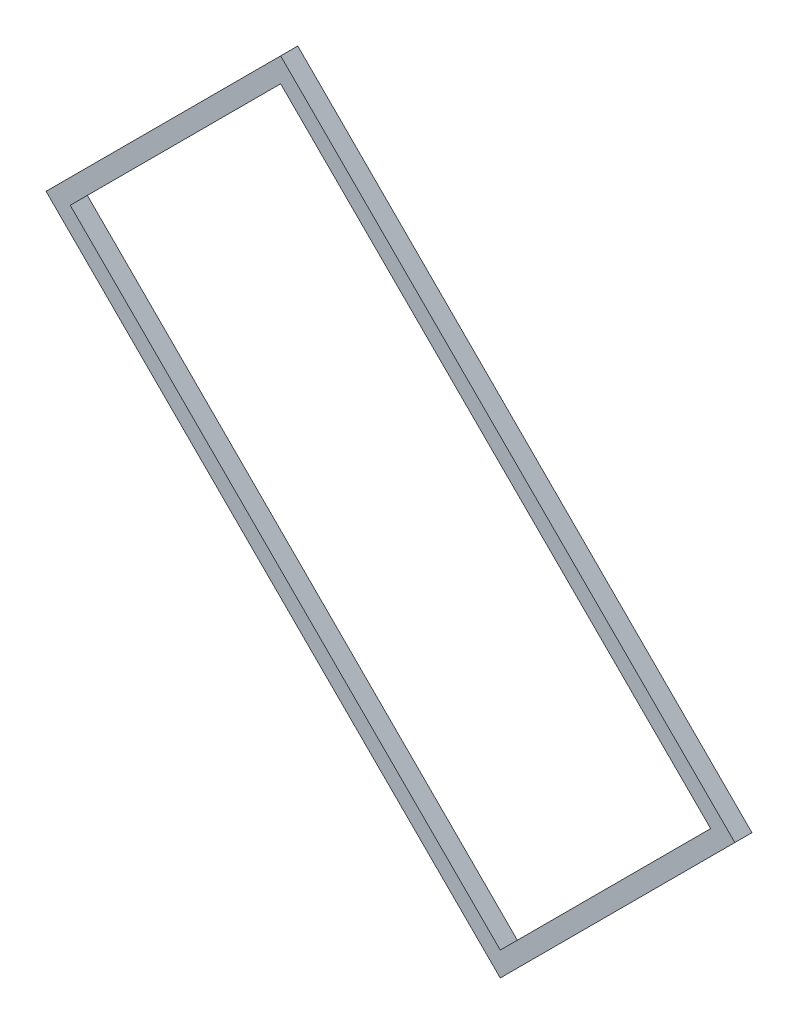
ISO-10303-21;
HEADER;
FILE_DESCRIPTION(('STEP AP214'),'2;1');
FILE_NAME('part.step','',(''),(''),'','','');
FILE_SCHEMA(('AUTOMOTIVE_DESIGN { 1 0 10303 214 1 1 1 1 }'));
ENDSEC;
DATA;
#1=APPLICATION_CONTEXT('core data for automotive mechanical design processes');
#2=APPLICATION_PROTOCOL_DEFINITION('international standard','automotive_design',2000,#1);
#3=PRODUCT_CONTEXT('',#1,'mechanical');
#4=PRODUCT('Part','Part','',(#3));
#5=PRODUCT_RELATED_PRODUCT_CATEGORY('part','',(#4));
#6=PRODUCT_DEFINITION_FORMATION('','',#4);
#7=PRODUCT_DEFINITION_CONTEXT('part definition',#1,'design');
#8=PRODUCT_DEFINITION('design','',#6,#7);
#9=PRODUCT_DEFINITION_SHAPE('','',#8);
#10=(LENGTH_UNIT() NAMED_UNIT(*) SI_UNIT(.MILLI.,.METRE.));
#11=(NAMED_UNIT(*) PLANE_ANGLE_UNIT() SI_UNIT($,.RADIAN.));
#12=(NAMED_UNIT(*) SI_UNIT($,.STERADIAN.) SOLID_ANGLE_UNIT());
#13=UNCERTAINTY_MEASURE_WITH_UNIT(LENGTH_MEASURE(1.E-05),#10,'distance_accuracy_value','');
#14=(GEOMETRIC_REPRESENTATION_CONTEXT(3) GLOBAL_UNCERTAINTY_ASSIGNED_CONTEXT((#13)) GLOBAL_UNIT_ASSIGNED_CONTEXT((#10,
#11,#12)) REPRESENTATION_CONTEXT('',''));
#15=CARTESIAN_POINT('',(0.,0.,0.));
#16=DIRECTION('',(0.,0.,1.));
#17=DIRECTION('',(1.,0.,0.));
#18=AXIS2_PLACEMENT_3D('',#15,#16,#17);
#19=CARTESIAN_POINT('',(-440.645068580759,52.202795795514,0.));
#20=DIRECTION('',(0.,0.,1.));
#21=DIRECTION('',(1.,0.,0.));
#22=AXIS2_PLACEMENT_3D('',#19,#20,#21);
#23=PLANE('',#22);
#24=DIRECTION('',(0.707106781186548,-0.707106781186547,0.));
#25=VECTOR('',#24,1.);
#26=CARTESIAN_POINT('',(-472.747716446628,145.823733624613,0.));
#27=LINE('',#26,#25);
#28=CARTESIAN_POINT('',(-472.747716446628,145.823733624613,0.));
#29=VERTEX_POINT('',#28);
#30=CARTESIAN_POINT('',(-347.02413075166,20.1001479296447,0.));
#31=VERTEX_POINT('',#30);
#32=EDGE_CURVE('E102',#29,#31,#27,.T.);
#33=ORIENTED_EDGE('',*,*,#32,.F.);
#34=DIRECTION('',(0.707106781186547,0.707106781186548,0.));
#35=VECTOR('',#34,1.);
#36=CARTESIAN_POINT('',(-534.266006409857,84.3054436613831,0.));
#37=LINE('',#36,#35);
#38=CARTESIAN_POINT('',(-534.266006409857,84.3054436613831,0.));
#39=VERTEX_POINT('',#38);
#40=EDGE_CURVE('E107',#39,#29,#37,.T.);
#41=ORIENTED_EDGE('',*,*,#40,.F.);
#42=DIRECTION('',(-0.707106781186548,0.707106781186547,0.));
#43=VECTOR('',#42,1.);
#44=CARTESIAN_POINT('',(-408.542420714889,-41.4181420335849,0.));
#45=LINE('',#44,#43);
#46=CARTESIAN_POINT('',(-408.542420714889,-41.4181420335849,0.));
#47=VERTEX_POINT('',#46);
#48=EDGE_CURVE('E156',#47,#39,#45,.T.);
#49=ORIENTED_EDGE('',*,*,#48,.F.);
#50=DIRECTION('',(-0.707106781186549,-0.707106781186547,0.));
#51=VECTOR('',#50,1.);
#52=CARTESIAN_POINT('',(-347.02413075166,20.1001479296447,0.));
#53=LINE('',#52,#51);
#54=EDGE_CURVE('E108',#31,#47,#53,.T.);
#55=ORIENTED_EDGE('',*,*,#54,.F.);
#56=EDGE_LOOP('',(#33,#41,#49,#55));
#57=FACE_BOUND('',#56,.T.);
#58=DIRECTION('',(-0.707106781186548,0.707106781186547,0.));
#59=VECTOR('',#58,1.);
#60=CARTESIAN_POINT('',(-408.542420714889,-48.4892098454504,0.));
#61=LINE('',#60,#59);
#62=CARTESIAN_POINT('',(-408.542420714889,-48.4892098454504,0.));
#63=VERTEX_POINT('',#62);
#64=CARTESIAN_POINT('',(-541.337074221723,84.3054436613831,0.));
#65=VERTEX_POINT('',#64);
#66=EDGE_CURVE('E26',#63,#65,#61,.T.);
#67=ORIENTED_EDGE('',*,*,#66,.T.);
#68=DIRECTION('',(0.707106781186547,0.707106781186548,0.));
#69=VECTOR('',#68,1.);
#70=CARTESIAN_POINT('',(-541.337074221723,84.3054436613831,0.));
#71=LINE('',#70,#69);
#72=CARTESIAN_POINT('',(-472.747716446628,152.894801436478,0.));
#73=VERTEX_POINT('',#72);
#74=EDGE_CURVE('E137',#65,#73,#71,.T.);
#75=ORIENTED_EDGE('',*,*,#74,.T.);
#76=DIRECTION('',(0.707106781186548,-0.707106781186547,0.));
#77=VECTOR('',#76,1.);
#78=CARTESIAN_POINT('',(-472.747716446628,152.894801436478,0.));
#79=LINE('',#78,#77);
#80=CARTESIAN_POINT('',(-339.953062939794,20.1001479296447,0.));
#81=VERTEX_POINT('',#80);
#82=EDGE_CURVE('E150',#73,#81,#79,.T.);
#83=ORIENTED_EDGE('',*,*,#82,.T.);
#84=DIRECTION('',(-0.707106781186548,-0.707106781186547,0.));
#85=VECTOR('',#84,1.);
#86=CARTESIAN_POINT('',(-339.953062939794,20.1001479296447,0.));
#87=LINE('',#86,#85);
#88=EDGE_CURVE('E183',#81,#63,#87,.T.);
#89=ORIENTED_EDGE('',*,*,#88,.T.);
#90=EDGE_LOOP('',(#67,#75,#83,#89));
#91=FACE_BOUND('',#90,.T.);
#92=ADVANCED_FACE('F17',(#57,#91),#23,.F.);
#93=CARTESIAN_POINT('',(-440.645068580759,52.202795795514,5.));
#94=DIRECTION('',(0.,0.,1.));
#95=DIRECTION('',(1.,0.,0.));
#96=AXIS2_PLACEMENT_3D('',#93,#94,#95);
#97=PLANE('',#96);
#98=DIRECTION('',(0.707106781186548,-0.707106781186547,0.));
#99=VECTOR('',#98,1.);
#100=CARTESIAN_POINT('',(-472.747716446628,145.823733624613,5.));
#101=LINE('',#100,#99);
#102=CARTESIAN_POINT('',(-472.747716446628,145.823733624613,5.));
#103=VERTEX_POINT('',#102);
#104=CARTESIAN_POINT('',(-347.02413075166,20.1001479296447,5.));
#105=VERTEX_POINT('',#104);
#106=EDGE_CURVE('E113',#103,#105,#101,.T.);
#107=ORIENTED_EDGE('',*,*,#106,.T.);
#108=DIRECTION('',(-0.707106781186549,-0.707106781186547,0.));
#109=VECTOR('',#108,1.);
#110=CARTESIAN_POINT('',(-347.02413075166,20.1001479296447,5.));
#111=LINE('',#110,#109);
#112=CARTESIAN_POINT('',(-408.542420714889,-41.4181420335849,5.));
#113=VERTEX_POINT('',#112);
#114=EDGE_CURVE('E163',#105,#113,#111,.T.);
#115=ORIENTED_EDGE('',*,*,#114,.T.);
#116=DIRECTION('',(-0.707106781186548,0.707106781186547,0.));
#117=VECTOR('',#116,1.);
#118=CARTESIAN_POINT('',(-408.542420714889,-41.4181420335849,5.));
#119=LINE('',#118,#117);
#120=CARTESIAN_POINT('',(-534.266006409857,84.3054436613831,5.));
#121=VERTEX_POINT('',#120);
#122=EDGE_CURVE('E144',#113,#121,#119,.T.);
#123=ORIENTED_EDGE('',*,*,#122,.T.);
#124=DIRECTION('',(0.707106781186547,0.707106781186548,0.));
#125=VECTOR('',#124,1.);
#126=CARTESIAN_POINT('',(-534.266006409857,84.3054436613831,5.));
#127=LINE('',#126,#125);
#128=EDGE_CURVE('E123',#121,#103,#127,.T.);
#129=ORIENTED_EDGE('',*,*,#128,.T.);
#130=EDGE_LOOP('',(#107,#115,#123,#129));
#131=FACE_BOUND('',#130,.T.);
#132=DIRECTION('',(0.707106781186548,-0.707106781186547,0.));
#133=VECTOR('',#132,1.);
#134=CARTESIAN_POINT('',(-408.542420714889,-48.4892098454504,5.));
#135=LINE('',#134,#133);
#136=CARTESIAN_POINT('',(-541.337074221723,84.3054436613831,5.));
#137=VERTEX_POINT('',#136);
#138=CARTESIAN_POINT('',(-408.542420714889,-48.4892098454504,5.));
#139=VERTEX_POINT('',#138);
#140=EDGE_CURVE('E11',#137,#139,#135,.T.);
#141=ORIENTED_EDGE('',*,*,#140,.T.);
#142=DIRECTION('',(0.707106781186548,0.707106781186547,0.));
#143=VECTOR('',#142,1.);
#144=CARTESIAN_POINT('',(-339.953062939794,20.1001479296447,5.));
#145=LINE('',#144,#143);
#146=CARTESIAN_POINT('',(-339.953062939794,20.1001479296447,5.));
#147=VERTEX_POINT('',#146);
#148=EDGE_CURVE('E187',#139,#147,#145,.T.);
#149=ORIENTED_EDGE('',*,*,#148,.T.);
#150=DIRECTION('',(-0.707106781186548,0.707106781186547,0.));
#151=VECTOR('',#150,1.);
#152=CARTESIAN_POINT('',(-472.747716446628,152.894801436478,5.));
#153=LINE('',#152,#151);
#154=CARTESIAN_POINT('',(-472.747716446628,152.894801436478,5.));
#155=VERTEX_POINT('',#154);
#156=EDGE_CURVE('E169',#147,#155,#153,.T.);
#157=ORIENTED_EDGE('',*,*,#156,.T.);
#158=DIRECTION('',(-0.707106781186547,-0.707106781186548,0.));
#159=VECTOR('',#158,1.);
#160=CARTESIAN_POINT('',(-541.337074221723,84.3054436613831,5.));
#161=LINE('',#160,#159);
#162=EDGE_CURVE('E151',#155,#137,#161,.T.);
#163=ORIENTED_EDGE('',*,*,#162,.T.);
#164=EDGE_LOOP('',(#141,#149,#157,#163));
#165=FACE_BOUND('',#164,.T.);
#166=ADVANCED_FACE('F19',(#131,#165),#97,.T.);
#167=CARTESIAN_POINT('',(-541.337074221723,84.3054436613831,0.));
#168=DIRECTION('',(-0.707106781186547,-0.707106781186548,0.));
#169=DIRECTION('',(-0.707106781186548,0.707106781186547,0.));
#170=AXIS2_PLACEMENT_3D('',#167,#168,#169);
#171=PLANE('',#170);
#172=ORIENTED_EDGE('',*,*,#66,.F.);
#173=DIRECTION('',(0.,0.,1.));
#174=VECTOR('',#173,1.);
#175=CARTESIAN_POINT('',(-408.542420714889,-48.4892098454504,0.));
#176=LINE('',#175,#174);
#177=EDGE_CURVE('E190',#63,#139,#176,.T.);
#178=ORIENTED_EDGE('',*,*,#177,.T.);
#179=ORIENTED_EDGE('',*,*,#140,.F.);
#180=DIRECTION('',(0.,0.,1.));
#181=VECTOR('',#180,1.);
#182=CARTESIAN_POINT('',(-541.337074221723,84.3054436613831,0.));
#183=LINE('',#182,#181);
#184=EDGE_CURVE('E140',#65,#137,#183,.T.);
#185=ORIENTED_EDGE('',*,*,#184,.F.);
#186=EDGE_LOOP('',(#172,#178,#179,#185));
#187=FACE_BOUND('',#186,.T.);
#188=ADVANCED_FACE('F194',(#187),#171,.T.);
#189=CARTESIAN_POINT('',(-408.542420714889,-48.4892098454504,0.));
#190=DIRECTION('',(0.707106781186547,-0.707106781186548,0.));
#191=DIRECTION('',(0.,0.,-1.));
#192=AXIS2_PLACEMENT_3D('',#189,#190,#191);
#193=PLANE('',#192);
#194=ORIENTED_EDGE('',*,*,#88,.F.);
#195=DIRECTION('',(0.,0.,1.));
#196=VECTOR('',#195,1.);
#197=CARTESIAN_POINT('',(-339.953062939794,20.1001479296447,0.));
#198=LINE('',#197,#196);
#199=EDGE_CURVE('E179',#81,#147,#198,.T.);
#200=ORIENTED_EDGE('',*,*,#199,.T.);
#201=ORIENTED_EDGE('',*,*,#148,.F.);
#202=ORIENTED_EDGE('',*,*,#177,.F.);
#203=EDGE_LOOP('',(#194,#200,#201,#202));
#204=FACE_BOUND('',#203,.T.);
#205=ADVANCED_FACE('F205',(#204),#193,.T.);
#206=CARTESIAN_POINT('',(-339.953062939794,20.1001479296447,0.));
#207=DIRECTION('',(0.707106781186547,0.707106781186548,0.));
#208=DIRECTION('',(0.,0.,-1.));
#209=AXIS2_PLACEMENT_3D('',#206,#207,#208);
#210=PLANE('',#209);
#211=ORIENTED_EDGE('',*,*,#82,.F.);
#212=DIRECTION('',(0.,0.,1.));
#213=VECTOR('',#212,1.);
#214=CARTESIAN_POINT('',(-472.747716446628,152.894801436478,0.));
#215=LINE('',#214,#213);
#216=EDGE_CURVE('E146',#73,#155,#215,.T.);
#217=ORIENTED_EDGE('',*,*,#216,.T.);
#218=ORIENTED_EDGE('',*,*,#156,.F.);
#219=ORIENTED_EDGE('',*,*,#199,.F.);
#220=EDGE_LOOP('',(#211,#217,#218,#219));
#221=FACE_BOUND('',#220,.T.);
#222=ADVANCED_FACE('F201',(#221),#210,.T.);
#223=CARTESIAN_POINT('',(-472.747716446628,152.894801436478,0.));
#224=DIRECTION('',(-0.707106781186548,0.707106781186547,0.));
#225=DIRECTION('',(0.,0.,1.));
#226=AXIS2_PLACEMENT_3D('',#223,#224,#225);
#227=PLANE('',#226);
#228=ORIENTED_EDGE('',*,*,#74,.F.);
#229=ORIENTED_EDGE('',*,*,#184,.T.);
#230=ORIENTED_EDGE('',*,*,#162,.F.);
#231=ORIENTED_EDGE('',*,*,#216,.F.);
#232=EDGE_LOOP('',(#228,#229,#230,#231));
#233=FACE_BOUND('',#232,.T.);
#234=ADVANCED_FACE('F198',(#233),#227,.T.);
#235=CARTESIAN_POINT('',(-472.747716446628,145.823733624613,0.));
#236=DIRECTION('',(-0.707106781186547,-0.707106781186548,0.));
#237=DIRECTION('',(-0.707106781186548,0.707106781186547,0.));
#238=AXIS2_PLACEMENT_3D('',#235,#236,#237);
#239=PLANE('',#238);
#240=ORIENTED_EDGE('',*,*,#32,.T.);
#241=DIRECTION('',(0.,0.,1.));
#242=VECTOR('',#241,1.);
#243=CARTESIAN_POINT('',(-347.02413075166,20.1001479296447,0.));
#244=LINE('',#243,#242);
#245=EDGE_CURVE('E114',#31,#105,#244,.T.);
#246=ORIENTED_EDGE('',*,*,#245,.T.);
#247=ORIENTED_EDGE('',*,*,#106,.F.);
#248=DIRECTION('',(0.,0.,1.));
#249=VECTOR('',#248,1.);
#250=CARTESIAN_POINT('',(-472.747716446628,145.823733624613,0.));
#251=LINE('',#250,#249);
#252=EDGE_CURVE('E117',#29,#103,#251,.T.);
#253=ORIENTED_EDGE('',*,*,#252,.F.);
#254=EDGE_LOOP('',(#240,#246,#247,#253));
#255=FACE_BOUND('',#254,.T.);
#256=ADVANCED_FACE('F118',(#255),#239,.T.);
#257=CARTESIAN_POINT('',(-347.02413075166,20.1001479296447,0.));
#258=DIRECTION('',(-0.707106781186547,0.707106781186549,0.));
#259=DIRECTION('',(0.,0.,1.));
#260=AXIS2_PLACEMENT_3D('',#257,#258,#259);
#261=PLANE('',#260);
#262=ORIENTED_EDGE('',*,*,#54,.T.);
#263=DIRECTION('',(0.,0.,1.));
#264=VECTOR('',#263,1.);
#265=CARTESIAN_POINT('',(-408.542420714889,-41.4181420335849,0.));
#266=LINE('',#265,#264);
#267=EDGE_CURVE('E141',#47,#113,#266,.T.);
#268=ORIENTED_EDGE('',*,*,#267,.T.);
#269=ORIENTED_EDGE('',*,*,#114,.F.);
#270=ORIENTED_EDGE('',*,*,#245,.F.);
#271=EDGE_LOOP('',(#262,#268,#269,#270));
#272=FACE_BOUND('',#271,.T.);
#273=ADVANCED_FACE('F216',(#272),#261,.T.);
#274=CARTESIAN_POINT('',(-408.542420714889,-41.4181420335849,0.));
#275=DIRECTION('',(0.707106781186547,0.707106781186548,0.));
#276=DIRECTION('',(0.,0.,-1.));
#277=AXIS2_PLACEMENT_3D('',#274,#275,#276);
#278=PLANE('',#277);
#279=ORIENTED_EDGE('',*,*,#48,.T.);
#280=DIRECTION('',(0.,0.,1.));
#281=VECTOR('',#280,1.);
#282=CARTESIAN_POINT('',(-534.266006409857,84.3054436613831,0.));
#283=LINE('',#282,#281);
#284=EDGE_CURVE('E128',#39,#121,#283,.T.);
#285=ORIENTED_EDGE('',*,*,#284,.T.);
#286=ORIENTED_EDGE('',*,*,#122,.F.);
#287=ORIENTED_EDGE('',*,*,#267,.F.);
#288=EDGE_LOOP('',(#279,#285,#286,#287));
#289=FACE_BOUND('',#288,.T.);
#290=ADVANCED_FACE('F220',(#289),#278,.T.);
#291=CARTESIAN_POINT('',(-534.266006409857,84.3054436613831,0.));
#292=DIRECTION('',(0.707106781186548,-0.707106781186547,0.));
#293=DIRECTION('',(0.,0.,-1.));
#294=AXIS2_PLACEMENT_3D('',#291,#292,#293);
#295=PLANE('',#294);
#296=ORIENTED_EDGE('',*,*,#40,.T.);
#297=ORIENTED_EDGE('',*,*,#252,.T.);
#298=ORIENTED_EDGE('',*,*,#128,.F.);
#299=ORIENTED_EDGE('',*,*,#284,.F.);
#300=EDGE_LOOP('',(#296,#297,#298,#299));
#301=FACE_BOUND('',#300,.T.);
#302=ADVANCED_FACE('F126',(#301),#295,.T.);
#303=CLOSED_SHELL('',(#92,#166,#188,#205,#222,#234,#256,#273,#290,#302));
#304=MANIFOLD_SOLID_BREP('B1',#303);
#305=ADVANCED_BREP_SHAPE_REPRESENTATION('',(#18,#304),#14);
#306=SHAPE_DEFINITION_REPRESENTATION(#9,#305);
ENDSEC;
END-ISO-10303-21;
